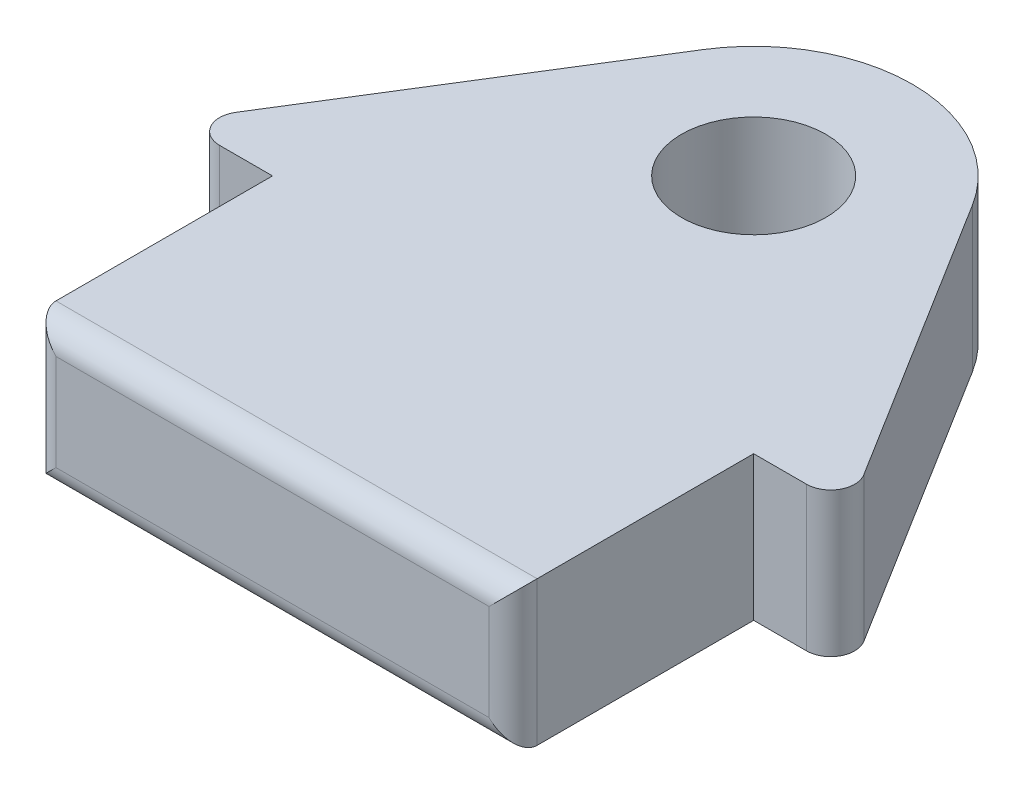
ISO-10303-21;
HEADER;
FILE_DESCRIPTION(('STEP AP214'),'2;1');
FILE_NAME('part.step','',(''),(''),'','','');
FILE_SCHEMA(('AUTOMOTIVE_DESIGN { 1 0 10303 214 1 1 1 1 }'));
ENDSEC;
DATA;
#1=APPLICATION_CONTEXT('core data for automotive mechanical design processes');
#2=APPLICATION_PROTOCOL_DEFINITION('international standard','automotive_design',2000,#1);
#3=PRODUCT_CONTEXT('',#1,'mechanical');
#4=PRODUCT('Part','Part','',(#3));
#5=PRODUCT_RELATED_PRODUCT_CATEGORY('part','',(#4));
#6=PRODUCT_DEFINITION_FORMATION('','',#4);
#7=PRODUCT_DEFINITION_CONTEXT('part definition',#1,'design');
#8=PRODUCT_DEFINITION('design','',#6,#7);
#9=PRODUCT_DEFINITION_SHAPE('','',#8);
#10=(LENGTH_UNIT() NAMED_UNIT(*) SI_UNIT(.MILLI.,.METRE.));
#11=(NAMED_UNIT(*) PLANE_ANGLE_UNIT() SI_UNIT($,.RADIAN.));
#12=(NAMED_UNIT(*) SI_UNIT($,.STERADIAN.) SOLID_ANGLE_UNIT());
#13=UNCERTAINTY_MEASURE_WITH_UNIT(LENGTH_MEASURE(1.E-05),#10,'distance_accuracy_value','');
#14=(GEOMETRIC_REPRESENTATION_CONTEXT(3) GLOBAL_UNCERTAINTY_ASSIGNED_CONTEXT((#13)) GLOBAL_UNIT_ASSIGNED_CONTEXT((#10,
#11,#12)) REPRESENTATION_CONTEXT('',''));
#15=CARTESIAN_POINT('',(0.,0.,0.));
#16=DIRECTION('',(0.,0.,1.));
#17=DIRECTION('',(1.,0.,0.));
#18=AXIS2_PLACEMENT_3D('',#15,#16,#17);
#19=CARTESIAN_POINT('',(0.,3.81,0.));
#20=DIRECTION('',(0.,1.,0.));
#21=DIRECTION('',(0.,0.,1.));
#22=AXIS2_PLACEMENT_3D('',#19,#20,#21);
#23=PLANE('',#22);
#24=DIRECTION('',(0.,0.,1.));
#25=VECTOR('',#24,1.);
#26=CARTESIAN_POINT('',(-6.35,3.81,6.35));
#27=LINE('',#26,#25);
#28=CARTESIAN_POINT('',(-6.35,3.81,6.35));
#29=VERTEX_POINT('',#28);
#30=CARTESIAN_POINT('',(-6.35,3.81,12.065));
#31=VERTEX_POINT('',#30);
#32=EDGE_CURVE('E164',#29,#31,#27,.T.);
#33=ORIENTED_EDGE('',*,*,#32,.T.);
#34=DIRECTION('',(1.,0.,0.));
#35=VECTOR('',#34,1.);
#36=CARTESIAN_POINT('',(6.35,3.81,12.065));
#37=LINE('',#36,#35);
#38=CARTESIAN_POINT('',(6.35,3.81,12.065));
#39=VERTEX_POINT('',#38);
#40=EDGE_CURVE('E258',#31,#39,#37,.T.);
#41=ORIENTED_EDGE('',*,*,#40,.T.);
#42=DIRECTION('',(0.,0.,-1.));
#43=VECTOR('',#42,1.);
#44=CARTESIAN_POINT('',(6.35,3.81,12.7));
#45=LINE('',#44,#43);
#46=CARTESIAN_POINT('',(6.35,3.81,6.35));
#47=VERTEX_POINT('',#46);
#48=EDGE_CURVE('E189',#39,#47,#45,.T.);
#49=ORIENTED_EDGE('',*,*,#48,.T.);
#50=DIRECTION('',(1.,0.,0.));
#51=VECTOR('',#50,1.);
#52=CARTESIAN_POINT('',(6.35,3.81,6.35));
#53=LINE('',#52,#51);
#54=CARTESIAN_POINT('',(7.74668018494395,3.81,6.35));
#55=VERTEX_POINT('',#54);
#56=EDGE_CURVE('E194',#47,#55,#53,.T.);
#57=ORIENTED_EDGE('',*,*,#56,.T.);
#58=CARTESIAN_POINT('',(7.74668018494395,3.81,5.715));
#59=DIRECTION('',(0.,1.,0.));
#60=DIRECTION('',(0.,0.,1.));
#61=AXIS2_PLACEMENT_3D('',#58,#59,#60);
#62=CIRCLE('',#61,0.635);
#63=CARTESIAN_POINT('',(8.28575143257674,3.81,5.3794002533141));
#64=VERTEX_POINT('',#63);
#65=EDGE_CURVE('E255',#55,#64,#62,.T.);
#66=ORIENTED_EDGE('',*,*,#65,.T.);
#67=DIRECTION('',(-0.528503538088022,0.,-0.848931098634301));
#68=VECTOR('',#67,1.);
#69=CARTESIAN_POINT('',(8.89,3.81,6.35));
#70=LINE('',#69,#68);
#71=CARTESIAN_POINT('',(3.55787023437636,3.81,-2.2149583281269));
#72=VERTEX_POINT('',#71);
#73=EDGE_CURVE('E201',#64,#72,#70,.T.);
#74=ORIENTED_EDGE('',*,*,#73,.T.);
#75=CARTESIAN_POINT('',(0.,3.81,0.));
#76=DIRECTION('',(0.,1.,0.));
#77=DIRECTION('',(0.,0.,1.));
#78=AXIS2_PLACEMENT_3D('',#75,#76,#77);
#79=CIRCLE('',#78,4.191);
#80=CARTESIAN_POINT('',(-3.55787023437636,3.81,-2.2149583281269));
#81=VERTEX_POINT('',#80);
#82=EDGE_CURVE('E204',#72,#81,#79,.T.);
#83=ORIENTED_EDGE('',*,*,#82,.T.);
#84=DIRECTION('',(-0.528503538088022,0.,0.848931098634302));
#85=VECTOR('',#84,1.);
#86=CARTESIAN_POINT('',(-8.89,3.81,6.35));
#87=LINE('',#86,#85);
#88=CARTESIAN_POINT('',(-8.28575143257674,3.81,5.37940025331411));
#89=VERTEX_POINT('',#88);
#90=EDGE_CURVE('E170',#81,#89,#87,.T.);
#91=ORIENTED_EDGE('',*,*,#90,.T.);
#92=CARTESIAN_POINT('',(-7.74668018494395,3.81,5.715));
#93=DIRECTION('',(0.,1.,0.));
#94=DIRECTION('',(0.,0.,1.));
#95=AXIS2_PLACEMENT_3D('',#92,#93,#94);
#96=CIRCLE('',#95,0.635);
#97=CARTESIAN_POINT('',(-7.74668018494395,3.81,6.35));
#98=VERTEX_POINT('',#97);
#99=EDGE_CURVE('E167',#89,#98,#96,.T.);
#100=ORIENTED_EDGE('',*,*,#99,.T.);
#101=DIRECTION('',(1.,0.,0.));
#102=VECTOR('',#101,1.);
#103=CARTESIAN_POINT('',(-8.89,3.81,6.35));
#104=LINE('',#103,#102);
#105=EDGE_CURVE('E160',#98,#29,#104,.T.);
#106=ORIENTED_EDGE('',*,*,#105,.T.);
#107=EDGE_LOOP('',(#33,#41,#49,#57,#66,#74,#83,#91,#100,#106));
#108=FACE_BOUND('',#107,.T.);
#109=CARTESIAN_POINT('',(0.,3.81,0.));
#110=DIRECTION('',(0.,1.,0.));
#111=DIRECTION('',(0.,0.,1.));
#112=AXIS2_PLACEMENT_3D('',#109,#110,#111);
#113=CIRCLE('',#112,1.905);
#114=CARTESIAN_POINT('',(0.,3.81,-1.905));
#115=VERTEX_POINT('',#114);
#116=EDGE_CURVE('E212',#115,#115,#113,.T.);
#117=ORIENTED_EDGE('',*,*,#116,.F.);
#118=EDGE_LOOP('',(#117));
#119=FACE_BOUND('',#118,.T.);
#120=ADVANCED_FACE('F43',(#108,#119),#23,.T.);
#121=CARTESIAN_POINT('',(0.,0.,0.));
#122=DIRECTION('',(0.,1.,0.));
#123=DIRECTION('',(0.,0.,1.));
#124=AXIS2_PLACEMENT_3D('',#121,#122,#123);
#125=PLANE('',#124);
#126=DIRECTION('',(0.,0.,-1.));
#127=VECTOR('',#126,1.);
#128=CARTESIAN_POINT('',(6.35,0.,12.7));
#129=LINE('',#128,#127);
#130=CARTESIAN_POINT('',(6.35,0.,12.065));
#131=VERTEX_POINT('',#130);
#132=CARTESIAN_POINT('',(6.35,0.,6.35));
#133=VERTEX_POINT('',#132);
#134=EDGE_CURVE('E218',#131,#133,#129,.T.);
#135=ORIENTED_EDGE('',*,*,#134,.F.);
#136=DIRECTION('',(1.,0.,0.));
#137=VECTOR('',#136,1.);
#138=CARTESIAN_POINT('',(0.,0.,12.065));
#139=LINE('',#138,#137);
#140=CARTESIAN_POINT('',(-6.35,0.,12.065));
#141=VERTEX_POINT('',#140);
#142=EDGE_CURVE('E267',#131,#141,#139,.F.);
#143=ORIENTED_EDGE('',*,*,#142,.T.);
#144=DIRECTION('',(0.,0.,1.));
#145=VECTOR('',#144,1.);
#146=CARTESIAN_POINT('',(-6.35,0.,6.35));
#147=LINE('',#146,#145);
#148=CARTESIAN_POINT('',(-6.35,0.,6.35));
#149=VERTEX_POINT('',#148);
#150=EDGE_CURVE('E215',#149,#141,#147,.T.);
#151=ORIENTED_EDGE('',*,*,#150,.F.);
#152=DIRECTION('',(1.,0.,0.));
#153=VECTOR('',#152,1.);
#154=CARTESIAN_POINT('',(-8.89,0.,6.35));
#155=LINE('',#154,#153);
#156=CARTESIAN_POINT('',(-7.74668018494395,0.,6.35));
#157=VERTEX_POINT('',#156);
#158=EDGE_CURVE('E176',#157,#149,#155,.T.);
#159=ORIENTED_EDGE('',*,*,#158,.F.);
#160=CARTESIAN_POINT('',(-7.74668018494395,0.,5.715));
#161=DIRECTION('',(0.,1.,0.));
#162=DIRECTION('',(0.,0.,1.));
#163=AXIS2_PLACEMENT_3D('',#160,#161,#162);
#164=CIRCLE('',#163,0.635);
#165=CARTESIAN_POINT('',(-8.28575143257674,0.,5.37940025331411));
#166=VERTEX_POINT('',#165);
#167=EDGE_CURVE('E64',#157,#166,#164,.F.);
#168=ORIENTED_EDGE('',*,*,#167,.T.);
#169=DIRECTION('',(-0.528503538088022,0.,0.848931098634302));
#170=VECTOR('',#169,1.);
#171=CARTESIAN_POINT('',(-8.89,0.,6.35));
#172=LINE('',#171,#170);
#173=CARTESIAN_POINT('',(-3.55787023437636,0.,-2.2149583281269));
#174=VERTEX_POINT('',#173);
#175=EDGE_CURVE('E208',#174,#166,#172,.T.);
#176=ORIENTED_EDGE('',*,*,#175,.F.);
#177=CARTESIAN_POINT('',(0.,0.,0.));
#178=DIRECTION('',(0.,1.,0.));
#179=DIRECTION('',(0.,0.,1.));
#180=AXIS2_PLACEMENT_3D('',#177,#178,#179);
#181=CIRCLE('',#180,4.191);
#182=CARTESIAN_POINT('',(3.55787023437636,0.,-2.2149583281269));
#183=VERTEX_POINT('',#182);
#184=EDGE_CURVE('E227',#183,#174,#181,.T.);
#185=ORIENTED_EDGE('',*,*,#184,.F.);
#186=DIRECTION('',(-0.528503538088022,0.,-0.848931098634301));
#187=VECTOR('',#186,1.);
#188=CARTESIAN_POINT('',(8.89,0.,6.35));
#189=LINE('',#188,#187);
#190=CARTESIAN_POINT('',(8.28575143257674,0.,5.3794002533141));
#191=VERTEX_POINT('',#190);
#192=EDGE_CURVE('E224',#191,#183,#189,.T.);
#193=ORIENTED_EDGE('',*,*,#192,.F.);
#194=CARTESIAN_POINT('',(7.74668018494395,0.,5.715));
#195=DIRECTION('',(0.,1.,0.));
#196=DIRECTION('',(0.,0.,1.));
#197=AXIS2_PLACEMENT_3D('',#194,#195,#196);
#198=CIRCLE('',#197,0.635);
#199=CARTESIAN_POINT('',(7.74668018494395,0.,6.35));
#200=VERTEX_POINT('',#199);
#201=EDGE_CURVE('E75',#191,#200,#198,.F.);
#202=ORIENTED_EDGE('',*,*,#201,.T.);
#203=DIRECTION('',(1.,0.,0.));
#204=VECTOR('',#203,1.);
#205=CARTESIAN_POINT('',(6.35,0.,6.35));
#206=LINE('',#205,#204);
#207=EDGE_CURVE('E221',#133,#200,#206,.T.);
#208=ORIENTED_EDGE('',*,*,#207,.F.);
#209=EDGE_LOOP('',(#135,#143,#151,#159,#168,#176,#185,#193,#202,#208));
#210=FACE_BOUND('',#209,.T.);
#211=CARTESIAN_POINT('',(0.,0.,0.));
#212=DIRECTION('',(0.,1.,0.));
#213=DIRECTION('',(0.,0.,1.));
#214=AXIS2_PLACEMENT_3D('',#211,#212,#213);
#215=CIRCLE('',#214,1.905);
#216=CARTESIAN_POINT('',(0.,0.,-1.905));
#217=VERTEX_POINT('',#216);
#218=EDGE_CURVE('E293',#217,#217,#215,.T.);
#219=ORIENTED_EDGE('',*,*,#218,.T.);
#220=EDGE_LOOP('',(#219));
#221=FACE_BOUND('',#220,.T.);
#222=ADVANCED_FACE('F312',(#210,#221),#125,.F.);
#223=CARTESIAN_POINT('',(-8.89,3.81,6.35));
#224=DIRECTION('',(0.848931098634302,0.,0.528503538088022));
#225=DIRECTION('',(0.528503538088022,0.,-0.848931098634302));
#226=AXIS2_PLACEMENT_3D('',#223,#224,#225);
#227=PLANE('',#226);
#228=ORIENTED_EDGE('',*,*,#175,.T.);
#229=DIRECTION('',(0.,-1.,0.));
#230=VECTOR('',#229,1.);
#231=CARTESIAN_POINT('',(-8.28575143257674,3.81,5.37940025331411));
#232=LINE('',#231,#230);
#233=EDGE_CURVE('E11',#166,#89,#232,.F.);
#234=ORIENTED_EDGE('',*,*,#233,.T.);
#235=ORIENTED_EDGE('',*,*,#90,.F.);
#236=DIRECTION('',(0.,-1.,0.));
#237=VECTOR('',#236,1.);
#238=CARTESIAN_POINT('',(-3.55787023437636,3.81,-2.2149583281269));
#239=LINE('',#238,#237);
#240=EDGE_CURVE('E207',#81,#174,#239,.T.);
#241=ORIENTED_EDGE('',*,*,#240,.T.);
#242=EDGE_LOOP('',(#228,#234,#235,#241));
#243=FACE_BOUND('',#242,.T.);
#244=ADVANCED_FACE('F348',(#243),#227,.F.);
#245=CARTESIAN_POINT('',(-8.89,3.81,6.35));
#246=DIRECTION('',(0.,0.,-1.));
#247=DIRECTION('',(-1.,0.,0.));
#248=AXIS2_PLACEMENT_3D('',#245,#246,#247);
#249=PLANE('',#248);
#250=ORIENTED_EDGE('',*,*,#105,.F.);
#251=DIRECTION('',(0.,-1.,0.));
#252=VECTOR('',#251,1.);
#253=CARTESIAN_POINT('',(-7.74668018494395,3.81,6.35));
#254=LINE('',#253,#252);
#255=EDGE_CURVE('E53',#98,#157,#254,.T.);
#256=ORIENTED_EDGE('',*,*,#255,.T.);
#257=ORIENTED_EDGE('',*,*,#158,.T.);
#258=DIRECTION('',(0.,-1.,0.));
#259=VECTOR('',#258,1.);
#260=CARTESIAN_POINT('',(-6.35,3.81,6.35));
#261=LINE('',#260,#259);
#262=EDGE_CURVE('E173',#29,#149,#261,.T.);
#263=ORIENTED_EDGE('',*,*,#262,.F.);
#264=EDGE_LOOP('',(#250,#256,#257,#263));
#265=FACE_BOUND('',#264,.T.);
#266=ADVANCED_FACE('F174',(#265),#249,.F.);
#267=CARTESIAN_POINT('',(-6.35,3.81,6.35));
#268=DIRECTION('',(1.,0.,0.));
#269=DIRECTION('',(0.,0.,-1.));
#270=AXIS2_PLACEMENT_3D('',#267,#268,#269);
#271=PLANE('',#270);
#272=ORIENTED_EDGE('',*,*,#150,.T.);
#273=DIRECTION('',(0.,-1.,0.));
#274=VECTOR('',#273,1.);
#275=CARTESIAN_POINT('',(-6.35,3.81,12.065));
#276=LINE('',#275,#274);
#277=EDGE_CURVE('E187',#141,#31,#276,.F.);
#278=ORIENTED_EDGE('',*,*,#277,.T.);
#279=ORIENTED_EDGE('',*,*,#32,.F.);
#280=ORIENTED_EDGE('',*,*,#262,.T.);
#281=EDGE_LOOP('',(#272,#278,#279,#280));
#282=FACE_BOUND('',#281,.T.);
#283=ADVANCED_FACE('F185',(#282),#271,.F.);
#284=CARTESIAN_POINT('',(-6.35,3.81,12.7));
#285=DIRECTION('',(0.,0.,-1.));
#286=DIRECTION('',(-1.,0.,0.));
#287=AXIS2_PLACEMENT_3D('',#284,#285,#286);
#288=PLANE('',#287);
#289=DIRECTION('',(1.,0.,0.));
#290=VECTOR('',#289,1.);
#291=CARTESIAN_POINT('',(-6.35,3.175,12.7));
#292=LINE('',#291,#290);
#293=CARTESIAN_POINT('',(5.715,3.175,12.7));
#294=VERTEX_POINT('',#293);
#295=CARTESIAN_POINT('',(-5.715,3.175,12.7));
#296=VERTEX_POINT('',#295);
#297=EDGE_CURVE('E245',#294,#296,#292,.F.);
#298=ORIENTED_EDGE('',*,*,#297,.T.);
#299=DIRECTION('',(0.,-1.,0.));
#300=VECTOR('',#299,1.);
#301=CARTESIAN_POINT('',(-5.715,3.81,12.7));
#302=LINE('',#301,#300);
#303=CARTESIAN_POINT('',(-5.715,0.635,12.7));
#304=VERTEX_POINT('',#303);
#305=EDGE_CURVE('E248',#296,#304,#302,.T.);
#306=ORIENTED_EDGE('',*,*,#305,.T.);
#307=DIRECTION('',(1.,0.,0.));
#308=VECTOR('',#307,1.);
#309=CARTESIAN_POINT('',(-6.35,0.635,12.7));
#310=LINE('',#309,#308);
#311=CARTESIAN_POINT('',(5.715,0.635,12.7));
#312=VERTEX_POINT('',#311);
#313=EDGE_CURVE('E181',#304,#312,#310,.T.);
#314=ORIENTED_EDGE('',*,*,#313,.T.);
#315=DIRECTION('',(0.,-1.,0.));
#316=VECTOR('',#315,1.);
#317=CARTESIAN_POINT('',(5.715,3.81,12.7));
#318=LINE('',#317,#316);
#319=EDGE_CURVE('E242',#312,#294,#318,.F.);
#320=ORIENTED_EDGE('',*,*,#319,.T.);
#321=EDGE_LOOP('',(#298,#306,#314,#320));
#322=FACE_BOUND('',#321,.T.);
#323=ADVANCED_FACE('F322',(#322),#288,.F.);
#324=CARTESIAN_POINT('',(6.35,3.81,12.7));
#325=DIRECTION('',(-1.,0.,0.));
#326=DIRECTION('',(0.,0.,1.));
#327=AXIS2_PLACEMENT_3D('',#324,#325,#326);
#328=PLANE('',#327);
#329=ORIENTED_EDGE('',*,*,#48,.F.);
#330=DIRECTION('',(0.,-1.,0.));
#331=VECTOR('',#330,1.);
#332=CARTESIAN_POINT('',(6.35,3.81,12.065));
#333=LINE('',#332,#331);
#334=EDGE_CURVE('E260',#39,#131,#333,.T.);
#335=ORIENTED_EDGE('',*,*,#334,.T.);
#336=ORIENTED_EDGE('',*,*,#134,.T.);
#337=DIRECTION('',(0.,-1.,0.));
#338=VECTOR('',#337,1.);
#339=CARTESIAN_POINT('',(6.35,3.81,6.35));
#340=LINE('',#339,#338);
#341=EDGE_CURVE('E182',#47,#133,#340,.T.);
#342=ORIENTED_EDGE('',*,*,#341,.F.);
#343=EDGE_LOOP('',(#329,#335,#336,#342));
#344=FACE_BOUND('',#343,.T.);
#345=ADVANCED_FACE('F328',(#344),#328,.F.);
#346=CARTESIAN_POINT('',(6.35,3.81,6.35));
#347=DIRECTION('',(0.,0.,-1.));
#348=DIRECTION('',(-1.,0.,0.));
#349=AXIS2_PLACEMENT_3D('',#346,#347,#348);
#350=PLANE('',#349);
#351=ORIENTED_EDGE('',*,*,#207,.T.);
#352=DIRECTION('',(0.,-1.,0.));
#353=VECTOR('',#352,1.);
#354=CARTESIAN_POINT('',(7.74668018494395,3.81,6.35));
#355=LINE('',#354,#353);
#356=EDGE_CURVE('E274',#200,#55,#355,.F.);
#357=ORIENTED_EDGE('',*,*,#356,.T.);
#358=ORIENTED_EDGE('',*,*,#56,.F.);
#359=ORIENTED_EDGE('',*,*,#341,.T.);
#360=EDGE_LOOP('',(#351,#357,#358,#359));
#361=FACE_BOUND('',#360,.T.);
#362=ADVANCED_FACE('F357',(#361),#350,.F.);
#363=CARTESIAN_POINT('',(8.89,3.81,6.35));
#364=DIRECTION('',(-0.848931098634302,0.,0.528503538088022));
#365=DIRECTION('',(0.528503538088022,0.,0.848931098634302));
#366=AXIS2_PLACEMENT_3D('',#363,#364,#365);
#367=PLANE('',#366);
#368=ORIENTED_EDGE('',*,*,#73,.F.);
#369=DIRECTION('',(0.,-1.,0.));
#370=VECTOR('',#369,1.);
#371=CARTESIAN_POINT('',(8.28575143257674,3.81,5.3794002533141));
#372=LINE('',#371,#370);
#373=EDGE_CURVE('E270',#64,#191,#372,.T.);
#374=ORIENTED_EDGE('',*,*,#373,.T.);
#375=ORIENTED_EDGE('',*,*,#192,.T.);
#376=DIRECTION('',(0.,-1.,0.));
#377=VECTOR('',#376,1.);
#378=CARTESIAN_POINT('',(3.55787023437636,3.81,-2.2149583281269));
#379=LINE('',#378,#377);
#380=EDGE_CURVE('E233',#72,#183,#379,.T.);
#381=ORIENTED_EDGE('',*,*,#380,.F.);
#382=EDGE_LOOP('',(#368,#374,#375,#381));
#383=FACE_BOUND('',#382,.T.);
#384=ADVANCED_FACE('F353',(#383),#367,.F.);
#385=CARTESIAN_POINT('',(0.,3.81,0.));
#386=DIRECTION('',(0.,-1.,0.));
#387=DIRECTION('',(0.,0.,-1.));
#388=AXIS2_PLACEMENT_3D('',#385,#386,#387);
#389=CYLINDRICAL_SURFACE('',#388,4.191);
#390=ORIENTED_EDGE('',*,*,#184,.T.);
#391=ORIENTED_EDGE('',*,*,#240,.F.);
#392=ORIENTED_EDGE('',*,*,#82,.F.);
#393=ORIENTED_EDGE('',*,*,#380,.T.);
#394=EDGE_LOOP('',(#390,#391,#392,#393));
#395=FACE_BOUND('',#394,.T.);
#396=ADVANCED_FACE('F340',(#395),#389,.T.);
#397=CARTESIAN_POINT('',(0.,3.81,0.));
#398=DIRECTION('',(0.,-1.,0.));
#399=DIRECTION('',(0.,0.,-1.));
#400=AXIS2_PLACEMENT_3D('',#397,#398,#399);
#401=CYLINDRICAL_SURFACE('',#400,1.905);
#402=CARTESIAN_POINT('',(0.,3.81,-1.905));
#403=CARTESIAN_POINT('',(0.,3.7703125,-1.905));
#404=CARTESIAN_POINT('',(0.,3.730625,-1.905));
#405=CARTESIAN_POINT('',(0.,3.65125,-1.905));
#406=CARTESIAN_POINT('',(0.,3.6115625,-1.905));
#407=CARTESIAN_POINT('',(0.,3.5321875,-1.905));
#408=CARTESIAN_POINT('',(0.,3.4925,-1.905));
#409=CARTESIAN_POINT('',(0.,3.413125,-1.905));
#410=CARTESIAN_POINT('',(0.,3.3734375,-1.905));
#411=CARTESIAN_POINT('',(0.,3.2940625,-1.905));
#412=CARTESIAN_POINT('',(0.,3.254375,-1.905));
#413=CARTESIAN_POINT('',(0.,3.175,-1.905));
#414=CARTESIAN_POINT('',(0.,3.1353125,-1.905));
#415=CARTESIAN_POINT('',(0.,3.0559375,-1.905));
#416=CARTESIAN_POINT('',(0.,3.01625,-1.905));
#417=CARTESIAN_POINT('',(0.,2.936875,-1.905));
#418=CARTESIAN_POINT('',(0.,2.8971875,-1.905));
#419=CARTESIAN_POINT('',(0.,2.8178125,-1.905));
#420=CARTESIAN_POINT('',(0.,2.778125,-1.905));
#421=CARTESIAN_POINT('',(0.,2.69875,-1.905));
#422=CARTESIAN_POINT('',(0.,2.6590625,-1.905));
#423=CARTESIAN_POINT('',(0.,2.5796875,-1.905));
#424=CARTESIAN_POINT('',(0.,2.54,-1.905));
#425=CARTESIAN_POINT('',(0.,2.460625,-1.905));
#426=CARTESIAN_POINT('',(0.,2.4209375,-1.905));
#427=CARTESIAN_POINT('',(0.,2.3415625,-1.905));
#428=CARTESIAN_POINT('',(0.,2.301875,-1.905));
#429=CARTESIAN_POINT('',(0.,2.2225,-1.905));
#430=CARTESIAN_POINT('',(0.,2.1828125,-1.905));
#431=CARTESIAN_POINT('',(0.,2.1034375,-1.905));
#432=CARTESIAN_POINT('',(0.,2.06375,-1.905));
#433=CARTESIAN_POINT('',(0.,1.984375,-1.905));
#434=CARTESIAN_POINT('',(0.,1.9446875,-1.905));
#435=CARTESIAN_POINT('',(0.,1.8653125,-1.905));
#436=CARTESIAN_POINT('',(0.,1.825625,-1.905));
#437=CARTESIAN_POINT('',(0.,1.74625,-1.905));
#438=CARTESIAN_POINT('',(0.,1.7065625,-1.905));
#439=CARTESIAN_POINT('',(0.,1.6271875,-1.905));
#440=CARTESIAN_POINT('',(0.,1.5875,-1.905));
#441=CARTESIAN_POINT('',(0.,1.508125,-1.905));
#442=CARTESIAN_POINT('',(0.,1.4684375,-1.905));
#443=CARTESIAN_POINT('',(0.,1.3890625,-1.905));
#444=CARTESIAN_POINT('',(0.,1.349375,-1.905));
#445=CARTESIAN_POINT('',(0.,1.27,-1.905));
#446=CARTESIAN_POINT('',(0.,1.2303125,-1.905));
#447=CARTESIAN_POINT('',(0.,1.1509375,-1.905));
#448=CARTESIAN_POINT('',(0.,1.11125,-1.905));
#449=CARTESIAN_POINT('',(0.,1.031875,-1.905));
#450=CARTESIAN_POINT('',(0.,0.9921875,-1.905));
#451=CARTESIAN_POINT('',(0.,0.9128125,-1.905));
#452=CARTESIAN_POINT('',(0.,0.873125,-1.905));
#453=CARTESIAN_POINT('',(0.,0.79375,-1.905));
#454=CARTESIAN_POINT('',(0.,0.7540625,-1.905));
#455=CARTESIAN_POINT('',(0.,0.6746875,-1.905));
#456=CARTESIAN_POINT('',(0.,0.635,-1.905));
#457=CARTESIAN_POINT('',(0.,0.555625,-1.905));
#458=CARTESIAN_POINT('',(0.,0.5159375,-1.905));
#459=CARTESIAN_POINT('',(0.,0.4365625,-1.905));
#460=CARTESIAN_POINT('',(0.,0.396875,-1.905));
#461=CARTESIAN_POINT('',(0.,0.3175,-1.905));
#462=CARTESIAN_POINT('',(0.,0.2778125,-1.905));
#463=CARTESIAN_POINT('',(0.,0.1984375,-1.905));
#464=CARTESIAN_POINT('',(0.,0.15875,-1.905));
#465=CARTESIAN_POINT('',(0.,0.0793749999999999,-1.905));
#466=CARTESIAN_POINT('',(0.,0.0396874999999999,-1.905));
#467=CARTESIAN_POINT('',(0.,0.,-1.905));
#468=B_SPLINE_CURVE_WITH_KNOTS('',3,(#402,#403,#404,#405,#406,#407,#408,#409,#410,#411,#412,
#413,#414,#415,#416,#417,#418,#419,#420,#421,#422,#423,#424,#425,#426,#427,#428,#429,#430,#431,
#432,#433,#434,#435,#436,#437,#438,#439,#440,#441,#442,#443,#444,#445,#446,#447,#448,#449,#450,
#451,#452,#453,#454,#455,#456,#457,#458,#459,#460,#461,#462,#463,#464,#465,#466,#467),
.UNSPECIFIED.,.F.,.F.,(4,2,2,2,2,2,2,2,2,2,2,2,2,2,2,2,2,2,2,2,2,2,2,2,2,2,2,2,2,2,2,2,4),(0.,
0.1190625,0.238125,0.3571875,0.47625,0.5953125,0.714375,0.8334375,0.9525,1.0715625,1.190625,
1.3096875,1.42875,1.5478125,1.666875,1.7859375,1.905,2.0240625,2.143125,2.2621875,2.38125,
2.5003125,2.619375,2.7384375,2.8575,2.9765625,3.095625,3.2146875,3.33375,3.4528125,3.571875,
3.6909375,3.81),.UNSPECIFIED.);
#469=EDGE_CURVE('BSEAM333',#115,#217,#468,.T.);
#470=ORIENTED_EDGE('',*,*,#116,.T.);
#471=ORIENTED_EDGE('',*,*,#218,.F.);
#472=ORIENTED_EDGE('',*,*,#469,.T.);
#473=ORIENTED_EDGE('',*,*,#469,.F.);
#474=EDGE_LOOP('',(#470,#472,#471,#473));
#475=FACE_BOUND('',#474,.T.);
#476=ADVANCED_FACE('F333',(#475),#401,.F.);
#477=CARTESIAN_POINT('',(5.715,3.81,12.065));
#478=DIRECTION('',(0.,-1.,0.));
#479=DIRECTION('',(0.,0.,-1.));
#480=AXIS2_PLACEMENT_3D('',#477,#478,#479);
#481=CYLINDRICAL_SURFACE('',#480,0.635);
#482=CARTESIAN_POINT('',(5.715,0.635,12.065));
#483=DIRECTION('',(0.707106781186547,0.707106781186547,0.));
#484=DIRECTION('',(0.707106781186547,-0.707106781186547,0.));
#485=AXIS2_PLACEMENT_3D('',#482,#483,#484);
#486=ELLIPSE('',#485,0.898025612106915,0.635);
#487=EDGE_CURVE('E284',#131,#312,#486,.F.);
#488=ORIENTED_EDGE('',*,*,#487,.F.);
#489=ORIENTED_EDGE('',*,*,#334,.F.);
#490=CARTESIAN_POINT('',(5.715,3.175,12.065));
#491=DIRECTION('',(0.707106781186547,-0.707106781186547,0.));
#492=DIRECTION('',(-0.707106781186547,-0.707106781186547,0.));
#493=AXIS2_PLACEMENT_3D('',#490,#491,#492);
#494=ELLIPSE('',#493,0.898025612106915,0.635);
#495=EDGE_CURVE('E47',#294,#39,#494,.F.);
#496=ORIENTED_EDGE('',*,*,#495,.F.);
#497=ORIENTED_EDGE('',*,*,#319,.F.);
#498=EDGE_LOOP('',(#488,#489,#496,#497));
#499=FACE_BOUND('',#498,.T.);
#500=ADVANCED_FACE('F331',(#499),#481,.T.);
#501=CARTESIAN_POINT('',(0.,3.175,12.065));
#502=DIRECTION('',(-1.,0.,0.));
#503=DIRECTION('',(0.,0.,1.));
#504=AXIS2_PLACEMENT_3D('',#501,#502,#503);
#505=CYLINDRICAL_SURFACE('',#504,0.635);
#506=ORIENTED_EDGE('',*,*,#495,.T.);
#507=ORIENTED_EDGE('',*,*,#40,.F.);
#508=CARTESIAN_POINT('',(-5.715,3.175,12.065));
#509=DIRECTION('',(-0.707106781186547,-0.707106781186547,0.));
#510=DIRECTION('',(-0.707106781186547,0.707106781186547,0.));
#511=AXIS2_PLACEMENT_3D('',#508,#509,#510);
#512=ELLIPSE('',#511,0.898025612106915,0.635);
#513=EDGE_CURVE('E282',#296,#31,#512,.T.);
#514=ORIENTED_EDGE('',*,*,#513,.F.);
#515=ORIENTED_EDGE('',*,*,#297,.F.);
#516=EDGE_LOOP('',(#506,#507,#514,#515));
#517=FACE_BOUND('',#516,.T.);
#518=ADVANCED_FACE('F323',(#517),#505,.T.);
#519=CARTESIAN_POINT('',(-6.35,0.635,12.065));
#520=DIRECTION('',(1.,0.,0.));
#521=DIRECTION('',(0.,0.,-1.));
#522=AXIS2_PLACEMENT_3D('',#519,#520,#521);
#523=CYLINDRICAL_SURFACE('',#522,0.635);
#524=ORIENTED_EDGE('',*,*,#487,.T.);
#525=ORIENTED_EDGE('',*,*,#313,.F.);
#526=CARTESIAN_POINT('',(-5.715,0.635,12.065));
#527=DIRECTION('',(0.707106781186547,-0.707106781186547,0.));
#528=DIRECTION('',(0.707106781186547,0.707106781186547,0.));
#529=AXIS2_PLACEMENT_3D('',#526,#527,#528);
#530=ELLIPSE('',#529,0.898025612106915,0.635);
#531=EDGE_CURVE('E279',#141,#304,#530,.F.);
#532=ORIENTED_EDGE('',*,*,#531,.F.);
#533=ORIENTED_EDGE('',*,*,#142,.F.);
#534=EDGE_LOOP('',(#524,#525,#532,#533));
#535=FACE_BOUND('',#534,.T.);
#536=ADVANCED_FACE('F319',(#535),#523,.T.);
#537=CARTESIAN_POINT('',(-5.715,3.81,12.065));
#538=DIRECTION('',(0.,-1.,0.));
#539=DIRECTION('',(0.,0.,-1.));
#540=AXIS2_PLACEMENT_3D('',#537,#538,#539);
#541=CYLINDRICAL_SURFACE('',#540,0.635);
#542=ORIENTED_EDGE('',*,*,#513,.T.);
#543=ORIENTED_EDGE('',*,*,#277,.F.);
#544=ORIENTED_EDGE('',*,*,#531,.T.);
#545=ORIENTED_EDGE('',*,*,#305,.F.);
#546=EDGE_LOOP('',(#542,#543,#544,#545));
#547=FACE_BOUND('',#546,.T.);
#548=ADVANCED_FACE('F316',(#547),#541,.T.);
#549=CARTESIAN_POINT('',(7.74668018494395,3.81,5.715));
#550=DIRECTION('',(0.,-1.,0.));
#551=DIRECTION('',(0.,0.,-1.));
#552=AXIS2_PLACEMENT_3D('',#549,#550,#551);
#553=CYLINDRICAL_SURFACE('',#552,0.635);
#554=ORIENTED_EDGE('',*,*,#65,.F.);
#555=ORIENTED_EDGE('',*,*,#356,.F.);
#556=ORIENTED_EDGE('',*,*,#201,.F.);
#557=ORIENTED_EDGE('',*,*,#373,.F.);
#558=EDGE_LOOP('',(#554,#555,#556,#557));
#559=FACE_BOUND('',#558,.T.);
#560=ADVANCED_FACE('F374',(#559),#553,.T.);
#561=CARTESIAN_POINT('',(-7.74668018494395,3.81,5.715));
#562=DIRECTION('',(0.,-1.,0.));
#563=DIRECTION('',(0.,0.,-1.));
#564=AXIS2_PLACEMENT_3D('',#561,#562,#563);
#565=CYLINDRICAL_SURFACE('',#564,0.635);
#566=ORIENTED_EDGE('',*,*,#99,.F.);
#567=ORIENTED_EDGE('',*,*,#233,.F.);
#568=ORIENTED_EDGE('',*,*,#167,.F.);
#569=ORIENTED_EDGE('',*,*,#255,.F.);
#570=EDGE_LOOP('',(#566,#567,#568,#569));
#571=FACE_BOUND('',#570,.T.);
#572=ADVANCED_FACE('F45',(#571),#565,.T.);
#573=CLOSED_SHELL('',(#120,#222,#244,#266,#283,#323,#345,#362,#384,#396,#476,#500,#518,#536,
#548,#560,#572));
#574=MANIFOLD_SOLID_BREP('B2',#573);
#575=ADVANCED_BREP_SHAPE_REPRESENTATION('',(#18,#574),#14);
#576=SHAPE_DEFINITION_REPRESENTATION(#9,#575);
ENDSEC;
END-ISO-10303-21;
